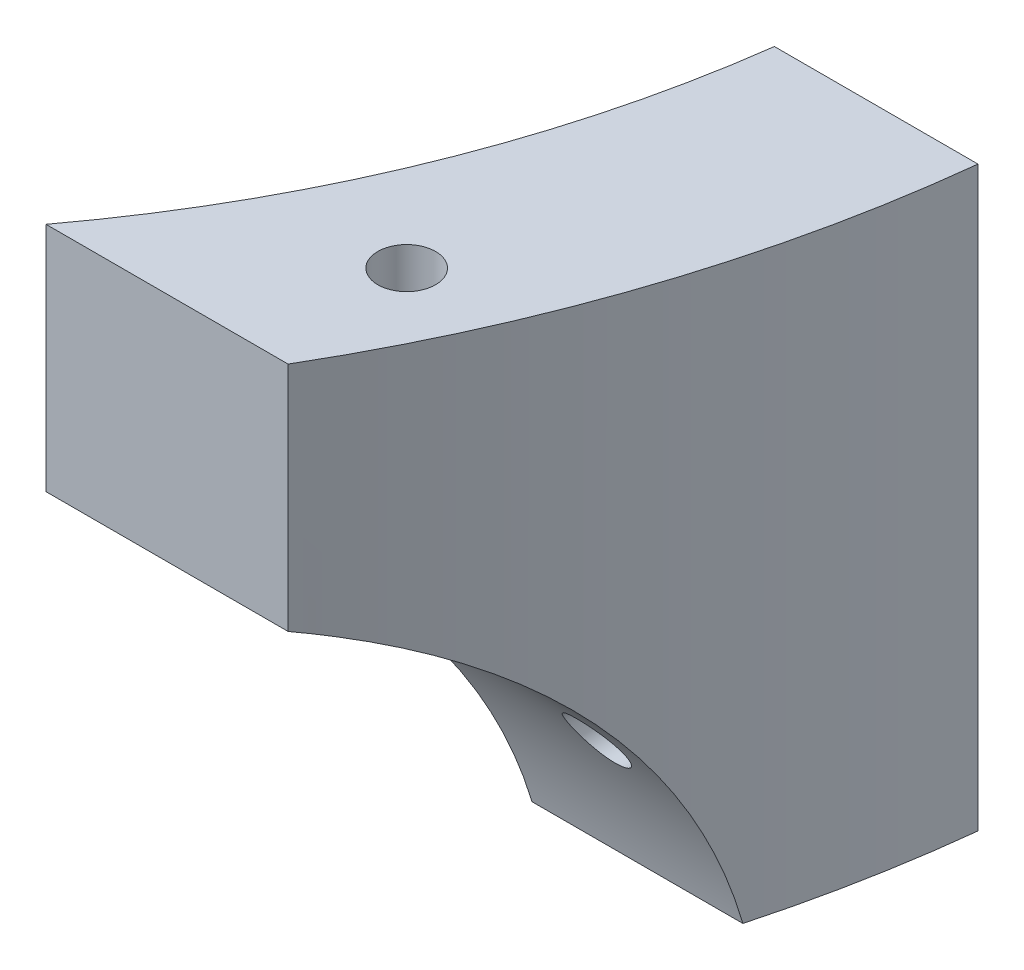
ISO-10303-21;
HEADER;
FILE_DESCRIPTION(('STEP AP214'),'2;1');
FILE_NAME('part.step','',(''),(''),'','','');
FILE_SCHEMA(('AUTOMOTIVE_DESIGN { 1 0 10303 214 1 1 1 1 }'));
ENDSEC;
DATA;
#1=APPLICATION_CONTEXT('core data for automotive mechanical design processes');
#2=APPLICATION_PROTOCOL_DEFINITION('international standard','automotive_design',2000,#1);
#3=PRODUCT_CONTEXT('',#1,'mechanical');
#4=PRODUCT('Part','Part','',(#3));
#5=PRODUCT_RELATED_PRODUCT_CATEGORY('part','',(#4));
#6=PRODUCT_DEFINITION_FORMATION('','',#4);
#7=PRODUCT_DEFINITION_CONTEXT('part definition',#1,'design');
#8=PRODUCT_DEFINITION('design','',#6,#7);
#9=PRODUCT_DEFINITION_SHAPE('','',#8);
#10=(LENGTH_UNIT() NAMED_UNIT(*) SI_UNIT(.MILLI.,.METRE.));
#11=(NAMED_UNIT(*) PLANE_ANGLE_UNIT() SI_UNIT($,.RADIAN.));
#12=(NAMED_UNIT(*) SI_UNIT($,.STERADIAN.) SOLID_ANGLE_UNIT());
#13=UNCERTAINTY_MEASURE_WITH_UNIT(LENGTH_MEASURE(1.E-05),#10,'distance_accuracy_value','');
#14=(GEOMETRIC_REPRESENTATION_CONTEXT(3) GLOBAL_UNCERTAINTY_ASSIGNED_CONTEXT((#13)) GLOBAL_UNIT_ASSIGNED_CONTEXT((#10,
#11,#12)) REPRESENTATION_CONTEXT('',''));
#15=CARTESIAN_POINT('',(0.,0.,0.));
#16=DIRECTION('',(0.,0.,1.));
#17=DIRECTION('',(1.,0.,0.));
#18=AXIS2_PLACEMENT_3D('',#15,#16,#17);
#19=CARTESIAN_POINT('',(0.,-100.,0.));
#20=DIRECTION('',(0.,-1.,0.));
#21=DIRECTION('',(0.,0.,-1.));
#22=AXIS2_PLACEMENT_3D('',#19,#20,#21);
#23=PLANE('',#22);
#24=DIRECTION('',(1.,0.,0.));
#25=VECTOR('',#24,1.);
#26=CARTESIAN_POINT('',(-91.805,-100.,23.690614962727));
#27=LINE('',#26,#25);
#28=CARTESIAN_POINT('',(73.0599944407869,-100.,23.690614962727));
#29=VERTEX_POINT('',#28);
#30=CARTESIAN_POINT('',(87.6601550745138,-100.,23.690614962727));
#31=VERTEX_POINT('',#30);
#32=EDGE_CURVE('E96',#29,#31,#27,.T.);
#33=ORIENTED_EDGE('',*,*,#32,.F.);
#34=CARTESIAN_POINT('',(0.,-100.,0.));
#35=DIRECTION('',(0.,-1.,0.));
#36=DIRECTION('',(0.,0.,-1.));
#37=AXIS2_PLACEMENT_3D('',#34,#35,#36);
#38=CIRCLE('',#37,76.805);
#39=CARTESIAN_POINT('',(76.1512181452142,-100.,9.99999999999961));
#40=VERTEX_POINT('',#39);
#41=EDGE_CURVE('E105',#29,#40,#38,.F.);
#42=ORIENTED_EDGE('',*,*,#41,.T.);
#43=DIRECTION('',(-1.,0.,0.));
#44=VECTOR('',#43,1.);
#45=CARTESIAN_POINT('',(0.,-100.,9.99999999999961));
#46=LINE('',#45,#44);
#47=CARTESIAN_POINT('',(90.252689849112,-100.,9.99999999999954));
#48=VERTEX_POINT('',#47);
#49=EDGE_CURVE('E100',#48,#40,#46,.T.);
#50=ORIENTED_EDGE('',*,*,#49,.F.);
#51=CARTESIAN_POINT('',(0.,-100.,0.));
#52=DIRECTION('',(0.,-1.,0.));
#53=DIRECTION('',(0.,0.,-1.));
#54=AXIS2_PLACEMENT_3D('',#51,#52,#53);
#55=CIRCLE('',#54,90.805);
#56=EDGE_CURVE('E87',#48,#31,#55,.T.);
#57=ORIENTED_EDGE('',*,*,#56,.T.);
#58=EDGE_LOOP('',(#33,#42,#50,#57));
#59=FACE_BOUND('',#58,.T.);
#60=ADVANCED_FACE('F34',(#59),#23,.T.);
#61=CARTESIAN_POINT('',(-91.805,-108.000167786146,56.3599898084857));
#62=DIRECTION('',(1.,0.,0.));
#63=DIRECTION('',(0.,0.,-1.));
#64=AXIS2_PLACEMENT_3D('',#61,#62,#63);
#65=CYLINDRICAL_SURFACE('',#64,33.6346657099366);
#66=CARTESIAN_POINT('',(76.7086084527525,-79.8030744101467,38.0238325620955));
#67=CARTESIAN_POINT('',(76.8074631880523,-79.8030738975218,38.0238333420797));
#68=CARTESIAN_POINT('',(76.9063170143825,-79.8078602212486,38.016466701305));
#69=CARTESIAN_POINT('',(77.100979430438,-79.826771626466,37.9874347832381));
#70=CARTESIAN_POINT('',(77.1967874217015,-79.8408985315017,37.9657667139049));
#71=CARTESIAN_POINT('',(77.3823659916335,-79.8777880488034,37.909417659888));
#72=CARTESIAN_POINT('',(77.4721542012125,-79.9005240178486,37.8747768267452));
#73=CARTESIAN_POINT('',(77.6439846819798,-79.9537186859987,37.7941676455856));
#74=CARTESIAN_POINT('',(77.726025374595,-79.9841789543068,37.7481969959527));
#75=CARTESIAN_POINT('',(77.8852347753342,-80.0536421232424,37.6440458711227));
#76=CARTESIAN_POINT('',(77.9618881490843,-80.0930224280342,37.5853333277198));
#77=CARTESIAN_POINT('',(78.1041276888143,-80.1779945740988,37.4596412940791));
#78=CARTESIAN_POINT('',(78.1697096835087,-80.2235887448855,37.3926587043771));
#79=CARTESIAN_POINT('',(78.2985043515619,-80.3271497210448,37.2418211856355));
#80=CARTESIAN_POINT('',(78.359854226063,-80.385944582878,37.1569472818849));
#81=CARTESIAN_POINT('',(78.4673962810873,-80.5087300873957,36.9815719394238));
#82=CARTESIAN_POINT('',(78.5135788486691,-80.5727239932793,36.8910669748327));
#83=CARTESIAN_POINT('',(78.598069532826,-80.7164303844296,36.6900572386444));
#84=CARTESIAN_POINT('',(78.6334789202214,-80.796903269908,36.5788771910687));
#85=CARTESIAN_POINT('',(78.6844148012419,-80.961384484584,36.3546323857026));
#86=CARTESIAN_POINT('',(78.6999311814584,-81.0453945896718,36.2415666988364));
#87=CARTESIAN_POINT('',(78.7127559067162,-81.2293065387434,35.9973102270788));
#88=CARTESIAN_POINT('',(78.7066554835882,-81.3295524238264,35.8661922772089));
#89=CARTESIAN_POINT('',(78.6691771852617,-81.530283205128,35.6075727790299));
#90=CARTESIAN_POINT('',(78.6377657442649,-81.6307682419527,35.4800762658109));
#91=CARTESIAN_POINT('',(78.546288983805,-81.8372421202246,35.2218367996325));
#92=CARTESIAN_POINT('',(78.4841159978511,-81.9430207721474,35.0916620796919));
#93=CARTESIAN_POINT('',(78.3299706100813,-82.1472912330253,34.8438296540359));
#94=CARTESIAN_POINT('',(78.2380571974696,-82.2457969963926,34.7261477777904));
#95=CARTESIAN_POINT('',(78.0609694914206,-82.3975724572225,34.5469989636401));
#96=CARTESIAN_POINT('',(77.9844781578502,-82.4546966033524,34.4801750261197));
#97=CARTESIAN_POINT('',(77.8185637564106,-82.5607950150454,34.3569077312002));
#98=CARTESIAN_POINT('',(77.729161972172,-82.6097824141519,34.3004476297094));
#99=CARTESIAN_POINT('',(77.5556728899328,-82.6887348952749,34.2099322661352));
#100=CARTESIAN_POINT('',(77.4735825599574,-82.7205395048951,34.1736693137063));
#101=CARTESIAN_POINT('',(77.302523756611,-82.7748905176247,34.1118927299615));
#102=CARTESIAN_POINT('',(77.2135591722291,-82.7974421105524,34.0863730727525));
#103=CARTESIAN_POINT('',(77.0302923510155,-82.8317260916055,34.0476396072101));
#104=CARTESIAN_POINT('',(76.935959315251,-82.8433875660741,34.0345064511625));
#105=CARTESIAN_POINT('',(76.7456776423994,-82.8545733596933,34.0219079858106));
#106=CARTESIAN_POINT('',(76.6497297694618,-82.8541032666764,34.022436383958));
#107=CARTESIAN_POINT('',(76.4700007841442,-82.8418016095751,34.0362937257992));
#108=CARTESIAN_POINT('',(76.3860207942212,-82.8311971768558,34.0482401206851));
#109=CARTESIAN_POINT('',(76.2217815161715,-82.8011556792901,34.0821749458543));
#110=CARTESIAN_POINT('',(76.1415227040881,-82.7817174877743,34.1041646570772));
#111=CARTESIAN_POINT('',(75.9833960606358,-82.7343028337479,34.158005024986));
#112=CARTESIAN_POINT('',(75.9057371254535,-82.7060282071829,34.1902007073067));
#113=CARTESIAN_POINT('',(75.7572686340529,-82.642717061117,34.2626426869511));
#114=CARTESIAN_POINT('',(75.6864631060374,-82.6076766006856,34.3028936767924));
#115=CARTESIAN_POINT('',(75.520202393519,-82.5142113696833,34.4108677396943));
#116=CARTESIAN_POINT('',(75.429086468424,-82.4526019232963,34.4825400804407));
#117=CARTESIAN_POINT('',(75.2632942760188,-82.3213293842057,34.6367691745697));
#118=CARTESIAN_POINT('',(75.1886548698492,-82.2516487548236,34.7193496854508));
#119=CARTESIAN_POINT('',(75.0382582503987,-82.0881041714256,34.9152729362535));
#120=CARTESIAN_POINT('',(74.9673159269042,-81.9926822265783,35.0310119134057));
#121=CARTESIAN_POINT('',(74.8508328978413,-81.7975637788303,35.2711707646397));
#122=CARTESIAN_POINT('',(74.8053008229314,-81.6978658359416,35.3955935720835));
#123=CARTESIAN_POINT('',(74.7391746646042,-81.4961912724539,35.6511343536208));
#124=CARTESIAN_POINT('',(74.7188227453968,-81.3942019853096,35.782304894407));
#125=CARTESIAN_POINT('',(74.7043503275137,-81.1914513139683,36.047154215224));
#126=CARTESIAN_POINT('',(74.7102436678378,-81.0906906056792,36.1808342815146));
#127=CARTESIAN_POINT('',(74.750524723525,-80.8867957470755,36.4555474962871));
#128=CARTESIAN_POINT('',(74.7866776765969,-80.7839095707219,36.5965155340601));
#129=CARTESIAN_POINT('',(74.8913395557247,-80.5860897067,36.8718487470639));
#130=CARTESIAN_POINT('',(74.9597870713606,-80.4911413264399,37.0062259221539));
#131=CARTESIAN_POINT('',(75.104252993412,-80.3402590193032,37.2227985729211));
#132=CARTESIAN_POINT('',(75.1717700687823,-80.2811920145813,37.3085136071337));
#133=CARTESIAN_POINT('',(75.3229256857671,-80.1707261400003,37.4702447312109));
#134=CARTESIAN_POINT('',(75.4065571324855,-80.1193239130669,37.5462650651054));
#135=CARTESIAN_POINT('',(75.5897719156697,-80.0257857442373,37.6856272623836));
#136=CARTESIAN_POINT('',(75.6894845103461,-79.9837320769019,37.7488561455346));
#137=CARTESIAN_POINT('',(75.9019735759856,-79.9116471300976,37.8578263825141));
#138=CARTESIAN_POINT('',(76.0147320094509,-79.8815995009962,37.9035915143534));
#139=CARTESIAN_POINT('',(76.2242795122289,-79.840287785588,37.9667030348256));
#140=CARTESIAN_POINT('',(76.3193683200653,-79.8263886578759,37.9880223866509));
#141=CARTESIAN_POINT('',(76.5125088976747,-79.8077845810088,38.0165831550542));
#142=CARTESIAN_POINT('',(76.6105591223229,-79.8030749185952,38.0238317884661));
#143=CARTESIAN_POINT('',(76.7086084527525,-79.8030744101467,38.0238325620955));
#144=B_SPLINE_CURVE_WITH_KNOTS('',3,(#66,#67,#68,#69,#70,#71,#72,#73,#74,#75,#76,#77,#78,#79,
#80,#81,#82,#83,#84,#85,#86,#87,#88,#89,#90,#91,#92,#93,#94,#95,#96,#97,#98,#99,#100,#101,#102,
#103,#104,#105,#106,#107,#108,#109,#110,#111,#112,#113,#114,#115,#116,#117,#118,#119,#120,#121,
#122,#123,#124,#125,#126,#127,#128,#129,#130,#131,#132,#133,#134,#135,#136,#137,#138,#139,#140,
#141,#142,#143),.UNSPECIFIED.,.T.,.F.,(4,2,2,2,2,2,2,2,2,2,2,2,2,2,2,2,2,2,2,2,2,2,2,2,2,2,2,2,
2,2,2,2,2,2,2,2,2,2,4),(0.,0.296183059627792,0.592423959629206,0.887755452545223,
1.18314699063767,1.49476809760526,1.80650635109705,2.16545321568322,2.52462714141039,
2.9482324067888,3.37205294362371,3.86547684730995,4.35955617616897,4.89350488274258,
5.42640094496851,5.77481014804785,6.12265139988388,6.40714902159363,6.69148685584818,
6.9776635720897,7.26370847692072,7.51899505208358,7.77431419597596,8.03939982135584,
8.30464032088804,8.69631909644513,9.08886544661426,9.58409564253129,10.0794939424851,
10.5796204888307,11.0800107807286,11.6118081549492,12.1425983291995,12.5133914093928,
12.8840216069173,13.2577947525027,13.6310571506686,13.9249778920575,14.2187478424099),.UNSPECIFIED.);
#145=CARTESIAN_POINT('',(76.7086084527525,-79.8030744101467,38.0238325620955));
#146=VERTEX_POINT('',#145);
#147=EDGE_CURVE('E184',#146,#146,#144,.T.);
#148=ORIENTED_EDGE('',*,*,#147,.T.);
#149=EDGE_LOOP('',(#148));
#150=FACE_BOUND('',#149,.T.);
#151=CARTESIAN_POINT('',(80.252689849112,-89.3600280202331,28.3629198381048));
#152=CARTESIAN_POINT('',(80.2526912522656,-89.218517691349,28.4571378059981));
#153=CARTESIAN_POINT('',(80.2677006344146,-89.0776655217365,28.5524789468897));
#154=CARTESIAN_POINT('',(80.3270662421826,-88.8014937174829,28.7424263371741));
#155=CARTESIAN_POINT('',(80.3714626547208,-88.6661819287826,28.8370314004827));
#156=CARTESIAN_POINT('',(80.4867218656363,-88.41131335724,29.0178819014394));
#157=CARTESIAN_POINT('',(80.5563341533893,-88.2913253129252,29.1043120072572));
#158=CARTESIAN_POINT('',(80.7220565925141,-88.0651439100761,29.2693079249137));
#159=CARTESIAN_POINT('',(80.8181002106033,-87.9589168867389,29.3478928167514));
#160=CARTESIAN_POINT('',(81.0014515022406,-87.7966072750411,29.4692159194503));
#161=CARTESIAN_POINT('',(81.0818745510073,-87.7353044033138,29.5154199162609));
#162=CARTESIAN_POINT('',(81.2541487292052,-87.6241128945463,29.5997211921549));
#163=CARTESIAN_POINT('',(81.3459932801024,-87.5742177334975,29.6378231039009));
#164=CARTESIAN_POINT('',(81.5404692042477,-87.4880920325661,29.7038744734995));
#165=CARTESIAN_POINT('',(81.6431908424873,-87.4519895100127,29.7317287330534));
#166=CARTESIAN_POINT('',(81.8556715528129,-87.3967717825963,29.7744285828653));
#167=CARTESIAN_POINT('',(81.965421883584,-87.3776359005536,29.7892900071326));
#168=CARTESIAN_POINT('',(82.1711361356633,-87.3594271559946,29.8034338991971));
#169=CARTESIAN_POINT('',(82.2667474729748,-87.3578126240353,29.8046899241227));
#170=CARTESIAN_POINT('',(82.456760165967,-87.3681953187991,29.796622272137));
#171=CARTESIAN_POINT('',(82.5511617979064,-87.3801893796346,29.7873010559032));
#172=CARTESIAN_POINT('',(82.7301662194213,-87.4158463453047,29.7596719878835));
#173=CARTESIAN_POINT('',(82.8150151367359,-87.4387503003944,29.7419489481131));
#174=CARTESIAN_POINT('',(82.9792413434667,-87.4946453852071,29.6988659041624));
#175=CARTESIAN_POINT('',(83.058617507645,-87.5276385818169,29.6735043351655));
#176=CARTESIAN_POINT('',(83.2176637827256,-87.6057798760004,29.6137320234502));
#177=CARTESIAN_POINT('',(83.296684288257,-87.651769006828,29.5787019500785));
#178=CARTESIAN_POINT('',(83.4457875930946,-87.7523529907083,29.5025752863149));
#179=CARTESIAN_POINT('',(83.5158654884074,-87.8069525292003,29.4614753937482));
#180=CARTESIAN_POINT('',(83.6586010806802,-87.9338032701895,29.3666740906567));
#181=CARTESIAN_POINT('',(83.7293916818367,-88.0074570101916,29.3120421920051));
#182=CARTESIAN_POINT('',(83.8576306079131,-88.16240708522,29.1981920682725));
#183=CARTESIAN_POINT('',(83.9150700873512,-88.2437084371854,29.1389708370763));
#184=CARTESIAN_POINT('',(84.026771811007,-88.4291260028297,29.0052721766148));
#185=CARTESIAN_POINT('',(84.0780754666407,-88.5345435912346,28.9301206375527));
#186=CARTESIAN_POINT('',(84.1613282135628,-88.7512652879117,28.777602411851));
#187=CARTESIAN_POINT('',(84.1932648316207,-88.8625731397144,28.7002343311754));
#188=CARTESIAN_POINT('',(84.2406684919595,-89.1046709260939,28.5341862978289));
#189=CARTESIAN_POINT('',(84.2531962061381,-89.2360032015602,28.4454422111528));
#190=CARTESIAN_POINT('',(84.25215189995,-89.4999506909898,28.2698161072916));
#191=CARTESIAN_POINT('',(84.238563003953,-89.6325666793494,28.1829353307928));
#192=CARTESIAN_POINT('',(84.1839306551936,-89.8975661017236,28.0119413170678));
#193=CARTESIAN_POINT('',(84.1423865096967,-90.0299003336932,27.9279084455895));
#194=CARTESIAN_POINT('',(84.0305784297958,-90.28665772827,27.7672434862293));
#195=CARTESIAN_POINT('',(83.9603623403731,-90.411093673001,27.6905993308736));
#196=CARTESIAN_POINT('',(83.813234552249,-90.6155048599556,27.5663324898372));
#197=CARTESIAN_POINT('',(83.7427298267729,-90.6986654119396,27.5163253912006));
#198=CARTESIAN_POINT('',(83.5866323478485,-90.8542554321589,27.4235662348201));
#199=CARTESIAN_POINT('',(83.501047187586,-90.9266902673042,27.3808105470638));
#200=CARTESIAN_POINT('',(83.315644035452,-91.0580004390346,27.3038448733183));
#201=CARTESIAN_POINT('',(83.2157398048065,-91.1167875101537,27.2696904006841));
#202=CARTESIAN_POINT('',(83.0047488983191,-91.2169095115892,27.2118105401086));
#203=CARTESIAN_POINT('',(82.8936694432905,-91.2582556227283,27.1880784703068));
#204=CARTESIAN_POINT('',(82.6774286880333,-91.3172416994415,27.1543099492793));
#205=CARTESIAN_POINT('',(82.5730561437351,-91.3370612993382,27.1430122251442));
#206=CARTESIAN_POINT('',(82.3619173808097,-91.3598589785468,27.1300215393748));
#207=CARTESIAN_POINT('',(82.2551524645316,-91.3628460077372,27.1283234736002));
#208=CARTESIAN_POINT('',(82.0506047601079,-91.3522331043274,27.1343669958675));
#209=CARTESIAN_POINT('',(81.9527362810752,-91.3398306730013,27.1414270750049));
#210=CARTESIAN_POINT('',(81.7607667003979,-91.3010583485693,27.1635692282412));
#211=CARTESIAN_POINT('',(81.6666653941342,-91.2746892151933,27.1786508660011));
#212=CARTESIAN_POINT('',(81.4838486898089,-91.2089209870821,27.2164449530412));
#213=CARTESIAN_POINT('',(81.3951863858957,-91.1694121161543,27.2392217177284));
#214=CARTESIAN_POINT('',(81.2260403736403,-91.079095101194,27.291609148098));
#215=CARTESIAN_POINT('',(81.1455586712683,-91.0282841954745,27.3212214841402));
#216=CARTESIAN_POINT('',(80.9881970233591,-90.9128669194592,27.3889751045422));
#217=CARTESIAN_POINT('',(80.9120923467246,-90.8474919427431,27.4276026139997));
#218=CARTESIAN_POINT('',(80.7719817138682,-90.7080948260554,27.5106997207636));
#219=CARTESIAN_POINT('',(80.7079815132791,-90.6340685993782,27.5551720803249));
#220=CARTESIAN_POINT('',(80.5852602747488,-90.4697488499692,27.6548423288401));
#221=CARTESIAN_POINT('',(80.5282345890566,-90.3785824908551,27.7106852553091));
#222=CARTESIAN_POINT('',(80.4303111829344,-90.1907893983237,27.8270439497223));
#223=CARTESIAN_POINT('',(80.3894185390953,-90.0941609570686,27.8875611813803));
#224=CARTESIAN_POINT('',(80.3216156305586,-89.8919830561987,28.0156867398863));
#225=CARTESIAN_POINT('',(80.2956692691389,-89.7862431739853,28.0835027879254));
#226=CARTESIAN_POINT('',(80.2612004570071,-89.5735542340117,28.2216391286503));
#227=CARTESIAN_POINT('',(80.2526887923473,-89.466604468861,28.2919609441908));
#228=CARTESIAN_POINT('',(80.252689849112,-89.3600280202331,28.3629198381048));
#229=B_SPLINE_CURVE_WITH_KNOTS('',3,(#151,#152,#153,#154,#155,#156,#157,#158,#159,#160,#161,
#162,#163,#164,#165,#166,#167,#168,#169,#170,#171,#172,#173,#174,#175,#176,#177,#178,#179,#180,
#181,#182,#183,#184,#185,#186,#187,#188,#189,#190,#191,#192,#193,#194,#195,#196,#197,#198,#199,
#200,#201,#202,#203,#204,#205,#206,#207,#208,#209,#210,#211,#212,#213,#214,#215,#216,#217,#218,
#219,#220,#221,#222,#223,#224,#225,#226,#227,#228),.UNSPECIFIED.,.T.,.F.,(4,2,2,2,2,2,2,2,2,2,2,
2,2,2,2,2,2,2,2,2,2,2,2,2,2,2,2,2,2,2,2,2,2,2,2,2,2,2,4),(0.,0.509524266156808,1.01974675293997,
1.50751880872896,1.99407409537153,2.32636717727305,2.65846974452322,2.99358390296581,
3.3282890954762,3.61365546830261,3.89895546742961,4.16679742046731,4.43469428053815,
4.72732749851309,5.02012050876882,5.36639758466885,5.71290342876809,6.12904839778024,
6.54546109873484,7.02029655659882,7.49543893951016,7.97932622586562,8.46240932614203,
8.82079350469927,9.17899774535529,9.5394578234118,9.89968646995233,10.2184829882252,
10.5371099863706,10.8324264921485,11.1277269355968,11.4255591862159,11.7234642931632,
12.0446921872617,12.3660724420981,12.7281580311149,13.090357467051,13.4738610821482,
13.8576018818835),.UNSPECIFIED.);
#230=CARTESIAN_POINT('',(80.252689849112,-89.3600280202331,28.3629198381048));
#231=VERTEX_POINT('',#230);
#232=EDGE_CURVE('E137',#231,#231,#229,.T.);
#233=ORIENTED_EDGE('',*,*,#232,.T.);
#234=EDGE_LOOP('',(#233));
#235=FACE_BOUND('',#234,.T.);
#236=ORIENTED_EDGE('',*,*,#32,.T.);
#237=CARTESIAN_POINT('',(87.6601550745138,-100.,23.690614962727));
#238=CARTESIAN_POINT('',(87.6309146409676,-99.5582270532689,23.7987903529996));
#239=CARTESIAN_POINT('',(87.5990558306299,-99.1188185983287,23.9158992066065));
#240=CARTESIAN_POINT('',(87.5299242538016,-98.2454988321091,24.1676991882331));
#241=CARTESIAN_POINT('',(87.4926514770593,-97.8115875312407,24.3023903495465));
#242=CARTESIAN_POINT('',(87.4125156290401,-96.9500400269717,24.589067182315));
#243=CARTESIAN_POINT('',(87.369652663084,-96.5224037055175,24.7410525279358));
#244=CARTESIAN_POINT('',(87.2781424524507,-95.6741962651977,25.0619570325673));
#245=CARTESIAN_POINT('',(87.2294952220577,-95.2536251288876,25.2308761497603));
#246=CARTESIAN_POINT('',(87.0746877030573,-94.0046710251831,25.7620459443834));
#247=CARTESIAN_POINT('',(86.9595445774442,-93.1877718538715,26.1491341707727));
#248=CARTESIAN_POINT('',(86.7035506629067,-91.5910077285846,26.9858020944198));
#249=CARTESIAN_POINT('',(86.5627006295914,-90.8111416869346,27.4353799548125));
#250=CARTESIAN_POINT('',(86.2532981145141,-89.2931803634732,28.393131381572));
#251=CARTESIAN_POINT('',(86.0847252847527,-88.5551163024875,28.9013479052129));
#252=CARTESIAN_POINT('',(85.7181545346951,-87.1264400456231,29.9710784567554));
#253=CARTESIAN_POINT('',(85.5201560977432,-86.4358286832319,30.53259342041));
#254=CARTESIAN_POINT('',(85.0931646526832,-85.1066151898962,31.703142958038));
#255=CARTESIAN_POINT('',(84.8641764957353,-84.4680049436589,32.3121700881044));
#256=CARTESIAN_POINT('',(84.3739007695728,-83.2464293462711,33.57155554728));
#257=CARTESIAN_POINT('',(84.1126142639453,-82.6634621639101,34.2219125150521));
#258=CARTESIAN_POINT('',(83.5564941386276,-81.5553169793308,35.5581862817601));
#259=CARTESIAN_POINT('',(83.2616168486545,-81.0302159917782,36.2441487251418));
#260=CARTESIAN_POINT('',(82.6381574982986,-80.0406098024235,37.6439895083848));
#261=CARTESIAN_POINT('',(82.3095717839275,-79.5761111823336,38.3578708694515));
#262=CARTESIAN_POINT('',(81.6190709229777,-78.7090707708359,39.806009538802));
#263=CARTESIAN_POINT('',(81.2571773877745,-78.3064892519784,40.5402534219982));
#264=CARTESIAN_POINT('',(80.5005849132904,-77.563085659544,42.0225616688551));
#265=CARTESIAN_POINT('',(80.105899217846,-77.2222388282199,42.7706203590796));
#266=CARTESIAN_POINT('',(79.480773296113,-76.7495372665461,43.9153218615551));
#267=CARTESIAN_POINT('',(79.2618443276316,-76.5955753510249,44.3092930162411));
#268=CARTESIAN_POINT('',(78.8159069045267,-76.3042908103359,45.0977350388794));
#269=CARTESIAN_POINT('',(78.5889144155218,-76.1669374431318,45.4922035743847));
#270=CARTESIAN_POINT('',(78.3577667284712,-76.0376066251599,45.8869090081963));
#271=B_SPLINE_CURVE_WITH_KNOTS('',3,(#237,#238,#239,#240,#241,#242,#243,#244,#245,#246,#247,
#248,#249,#250,#251,#252,#253,#254,#255,#256,#257,#258,#259,#260,#261,#262,#263,#264,#265,#266,
#267,#268,#269,#270),.UNSPECIFIED.,.F.,.F.,(4,2,2,2,2,2,2,2,2,2,2,2,2,2,2,2,4),(0.,
1.36718200591948,2.73436660076041,4.10152544117546,5.46868090549962,8.19895604622811,
10.9291509482554,13.6613587784873,16.3936145865799,19.1254431784267,21.8571818349041,
24.5925133637657,27.3281417161062,30.0620074367266,32.7947743431797,34.2233178368993,
35.6491752833978),.UNSPECIFIED.);
#272=CARTESIAN_POINT('',(78.3577667284712,-76.0376066251599,45.8869090081963));
#273=VERTEX_POINT('',#272);
#274=EDGE_CURVE('E117',#31,#273,#271,.T.);
#275=ORIENTED_EDGE('',*,*,#274,.T.);
#276=DIRECTION('',(1.,0.,0.));
#277=VECTOR('',#276,1.);
#278=CARTESIAN_POINT('',(-91.805,-76.0376066251599,45.8869090081963));
#279=LINE('',#278,#277);
#280=CARTESIAN_POINT('',(61.5905805028173,-76.0376066251599,45.8869090081963));
#281=VERTEX_POINT('',#280);
#282=EDGE_CURVE('E167',#281,#273,#279,.T.);
#283=ORIENTED_EDGE('',*,*,#282,.F.);
#284=CARTESIAN_POINT('',(73.0599944407869,-100.,23.690614962727));
#285=CARTESIAN_POINT('',(73.0254903331157,-99.565522425293,23.7970033950321));
#286=CARTESIAN_POINT('',(72.9879451110618,-99.1334016530759,23.9120169328063));
#287=CARTESIAN_POINT('',(72.9065715540669,-98.2746285789678,24.158994155574));
#288=CARTESIAN_POINT('',(72.8627431956204,-97.8479762975414,24.290957903979));
#289=CARTESIAN_POINT('',(72.7686030853388,-97.0009014679731,24.5715336452272));
#290=CARTESIAN_POINT('',(72.7182913815018,-96.5804788737371,24.7201455148189));
#291=CARTESIAN_POINT('',(72.6109668269498,-95.7466463394466,25.0336363372437));
#292=CARTESIAN_POINT('',(72.5539539964743,-95.3332363782161,25.1985152409451));
#293=CARTESIAN_POINT('',(72.3726494804507,-94.1055987152668,25.7165645262563));
#294=CARTESIAN_POINT('',(72.2379602204125,-93.3027635778211,26.0935456426208));
#295=CARTESIAN_POINT('',(71.9389123960309,-91.7337821017035,26.907034570689));
#296=CARTESIAN_POINT('',(71.7745548646913,-90.967634486803,27.3435403097069));
#297=CARTESIAN_POINT('',(71.4139556980102,-89.4765479541124,28.2719480259201));
#298=CARTESIAN_POINT('',(71.2176860161786,-88.7516460492144,28.7638986139185));
#299=CARTESIAN_POINT('',(70.7914528461497,-87.3486859186278,29.7974929302104));
#300=CARTESIAN_POINT('',(70.5614887969271,-86.6706284731955,30.3391374858727));
#301=CARTESIAN_POINT('',(70.066336403702,-85.3658740223663,31.4657723478197));
#302=CARTESIAN_POINT('',(69.801163841521,-84.7391542077822,32.0507431819411));
#303=CARTESIAN_POINT('',(69.2342929315144,-83.5401645225451,33.2575553717361));
#304=CARTESIAN_POINT('',(68.9325955901839,-82.9678931522593,33.8793957111744));
#305=CARTESIAN_POINT('',(68.2917432191704,-81.8798854247265,35.1532989950403));
#306=CARTESIAN_POINT('',(67.9525637792321,-81.3641863510135,35.8053814723814));
#307=CARTESIAN_POINT('',(67.2367328870513,-80.3911381566973,37.1321683005325));
#308=CARTESIAN_POINT('',(66.8600783026406,-79.9337939206886,37.806874539104));
#309=CARTESIAN_POINT('',(66.0697472035868,-79.0778453915696,39.1716522776844));
#310=CARTESIAN_POINT('',(65.6560691341393,-78.6792435672139,39.8617244220707));
#311=CARTESIAN_POINT('',(64.79277787333,-77.9402163629166,41.2501145074061));
#312=CARTESIAN_POINT('',(64.3431755122781,-77.5997735458329,41.948429909508));
#313=CARTESIAN_POINT('',(63.5149954930007,-77.0459573100791,43.1888496352309));
#314=CARTESIAN_POINT('',(63.1433420577473,-76.8212570833388,43.7305761336415));
#315=CARTESIAN_POINT('',(62.3811244922268,-76.4050722225581,44.811167654372));
#316=CARTESIAN_POINT('',(61.9906123888517,-76.2135022140975,45.3500364550486));
#317=CARTESIAN_POINT('',(61.5905805028132,-76.0376066251599,45.8869090081963));
#318=B_SPLINE_CURVE_WITH_KNOTS('',3,(#284,#285,#286,#287,#288,#289,#290,#291,#292,#293,#294,
#295,#296,#297,#298,#299,#300,#301,#302,#303,#304,#305,#306,#307,#308,#309,#310,#311,#312,#313,
#314,#315,#316,#317),.UNSPECIFIED.,.F.,.F.,(4,2,2,2,2,2,2,2,2,2,2,2,2,2,2,2,4),(0.,
1.34582075493443,2.69164654480015,4.03746237173253,5.38327413397888,8.07109732988472,
10.7588269579409,13.4489316355438,16.1390811095913,18.8280287995816,21.5169024084456,
24.2075375854001,26.898397834554,29.5893711396751,32.2795362200218,34.3614815849997,
36.4379792711811),.UNSPECIFIED.);
#319=EDGE_CURVE('E57',#29,#281,#318,.T.);
#320=ORIENTED_EDGE('',*,*,#319,.F.);
#321=EDGE_LOOP('',(#236,#275,#283,#320));
#322=FACE_BOUND('',#321,.T.);
#323=ADVANCED_FACE('F123',(#150,#235,#322),#65,.F.);
#324=CARTESIAN_POINT('',(0.,-100.,9.99999999999961));
#325=DIRECTION('',(0.,0.,-1.));
#326=DIRECTION('',(-1.,0.,0.));
#327=AXIS2_PLACEMENT_3D('',#324,#325,#326);
#328=PLANE('',#327);
#329=CARTESIAN_POINT('',(82.252689849112,-89.3600280202331,9.99999999999961));
#330=DIRECTION('',(0.,0.,-1.));
#331=DIRECTION('',(-1.,0.,0.));
#332=AXIS2_PLACEMENT_3D('',#329,#330,#331);
#333=CIRCLE('',#332,2.);
#334=CARTESIAN_POINT('',(80.252689849112,-89.3600280202331,9.99999999999961));
#335=VERTEX_POINT('',#334);
#336=EDGE_CURVE('E145',#335,#335,#333,.T.);
#337=ORIENTED_EDGE('',*,*,#336,.F.);
#338=EDGE_LOOP('',(#337));
#339=FACE_BOUND('',#338,.T.);
#340=DIRECTION('',(-1.,0.,0.));
#341=VECTOR('',#340,1.);
#342=CARTESIAN_POINT('',(0.,-60.,9.99999999999961));
#343=LINE('',#342,#341);
#344=CARTESIAN_POINT('',(90.252689849112,-60.,9.99999999999961));
#345=VERTEX_POINT('',#344);
#346=CARTESIAN_POINT('',(76.1512181452142,-60.,9.99999999999961));
#347=VERTEX_POINT('',#346);
#348=EDGE_CURVE('E80',#345,#347,#343,.T.);
#349=ORIENTED_EDGE('',*,*,#348,.F.);
#350=DIRECTION('',(0.,1.,0.));
#351=VECTOR('',#350,1.);
#352=CARTESIAN_POINT('',(90.252689849112,-100.,9.99999999999954));
#353=LINE('',#352,#351);
#354=EDGE_CURVE('E101',#48,#345,#353,.T.);
#355=ORIENTED_EDGE('',*,*,#354,.F.);
#356=ORIENTED_EDGE('',*,*,#49,.T.);
#357=DIRECTION('',(0.,1.,0.));
#358=VECTOR('',#357,1.);
#359=CARTESIAN_POINT('',(76.1512181452142,-100.,9.99999999999961));
#360=LINE('',#359,#358);
#361=EDGE_CURVE('E43',#40,#347,#360,.T.);
#362=ORIENTED_EDGE('',*,*,#361,.T.);
#363=EDGE_LOOP('',(#349,#355,#356,#362));
#364=FACE_BOUND('',#363,.T.);
#365=ADVANCED_FACE('F98',(#339,#364),#328,.T.);
#366=CARTESIAN_POINT('',(-91.805,-59.9171673050235,45.8869090081963));
#367=DIRECTION('',(0.,0.,1.));
#368=DIRECTION('',(1.,0.,0.));
#369=AXIS2_PLACEMENT_3D('',#366,#367,#368);
#370=PLANE('',#369);
#371=DIRECTION('',(1.,0.,0.));
#372=VECTOR('',#371,1.);
#373=CARTESIAN_POINT('',(-91.805,-60.,45.8869090081963));
#374=LINE('',#373,#372);
#375=CARTESIAN_POINT('',(61.5905805028132,-60.,45.8869090081963));
#376=VERTEX_POINT('',#375);
#377=CARTESIAN_POINT('',(78.3577667284712,-60.,45.8869090081963));
#378=VERTEX_POINT('',#377);
#379=EDGE_CURVE('E11',#376,#378,#374,.T.);
#380=ORIENTED_EDGE('',*,*,#379,.F.);
#381=DIRECTION('',(0.,1.,0.));
#382=VECTOR('',#381,1.);
#383=CARTESIAN_POINT('',(61.5905805028132,-60.,45.8869090081963));
#384=LINE('',#383,#382);
#385=EDGE_CURVE('E95',#376,#281,#384,.F.);
#386=ORIENTED_EDGE('',*,*,#385,.T.);
#387=ORIENTED_EDGE('',*,*,#282,.T.);
#388=DIRECTION('',(0.,1.,0.));
#389=VECTOR('',#388,1.);
#390=CARTESIAN_POINT('',(78.3577667284712,-60.,45.8869090081963));
#391=LINE('',#390,#389);
#392=EDGE_CURVE('E88',#378,#273,#391,.F.);
#393=ORIENTED_EDGE('',*,*,#392,.F.);
#394=EDGE_LOOP('',(#380,#386,#387,#393));
#395=FACE_BOUND('',#394,.T.);
#396=ADVANCED_FACE('F129',(#395),#370,.T.);
#397=CARTESIAN_POINT('',(0.,-60.,0.));
#398=DIRECTION('',(0.,1.,0.));
#399=DIRECTION('',(0.,0.,1.));
#400=AXIS2_PLACEMENT_3D('',#397,#398,#399);
#401=CYLINDRICAL_SURFACE('',#400,90.805);
#402=CARTESIAN_POINT('',(0.,-60.,0.));
#403=DIRECTION('',(0.,-1.,0.));
#404=DIRECTION('',(0.,0.,-1.));
#405=AXIS2_PLACEMENT_3D('',#402,#403,#404);
#406=CIRCLE('',#405,90.805);
#407=EDGE_CURVE('E83',#378,#345,#406,.F.);
#408=ORIENTED_EDGE('',*,*,#407,.F.);
#409=ORIENTED_EDGE('',*,*,#392,.T.);
#410=ORIENTED_EDGE('',*,*,#274,.F.);
#411=ORIENTED_EDGE('',*,*,#56,.F.);
#412=ORIENTED_EDGE('',*,*,#354,.T.);
#413=EDGE_LOOP('',(#408,#409,#410,#411,#412));
#414=FACE_BOUND('',#413,.T.);
#415=ADVANCED_FACE('F158',(#414),#401,.T.);
#416=CARTESIAN_POINT('',(0.,-60.,0.));
#417=DIRECTION('',(0.,1.,0.));
#418=DIRECTION('',(0.,0.,1.));
#419=AXIS2_PLACEMENT_3D('',#416,#417,#418);
#420=CYLINDRICAL_SURFACE('',#419,76.805);
#421=ORIENTED_EDGE('',*,*,#385,.F.);
#422=CARTESIAN_POINT('',(0.,-60.,0.));
#423=DIRECTION('',(0.,-1.,0.));
#424=DIRECTION('',(0.,0.,-1.));
#425=AXIS2_PLACEMENT_3D('',#422,#423,#424);
#426=CIRCLE('',#425,76.805);
#427=EDGE_CURVE('E49',#376,#347,#426,.F.);
#428=ORIENTED_EDGE('',*,*,#427,.T.);
#429=ORIENTED_EDGE('',*,*,#361,.F.);
#430=ORIENTED_EDGE('',*,*,#41,.F.);
#431=ORIENTED_EDGE('',*,*,#319,.T.);
#432=EDGE_LOOP('',(#421,#428,#429,#430,#431));
#433=FACE_BOUND('',#432,.T.);
#434=ADVANCED_FACE('F36',(#433),#420,.F.);
#435=CARTESIAN_POINT('',(-91.805,-60.,9.99999999999961));
#436=DIRECTION('',(0.,-1.,0.));
#437=DIRECTION('',(0.,0.,-1.));
#438=AXIS2_PLACEMENT_3D('',#435,#436,#437);
#439=PLANE('',#438);
#440=CARTESIAN_POINT('',(76.7086084527525,-60.,36.0238325620955));
#441=DIRECTION('',(0.,1.,0.));
#442=DIRECTION('',(0.,0.,1.));
#443=AXIS2_PLACEMENT_3D('',#440,#441,#442);
#444=CIRCLE('',#443,2.);
#445=CARTESIAN_POINT('',(76.7086084527525,-60.,38.0238325620955));
#446=VERTEX_POINT('',#445);
#447=EDGE_CURVE('E186',#446,#446,#444,.T.);
#448=ORIENTED_EDGE('',*,*,#447,.F.);
#449=EDGE_LOOP('',(#448));
#450=FACE_BOUND('',#449,.T.);
#451=ORIENTED_EDGE('',*,*,#379,.T.);
#452=ORIENTED_EDGE('',*,*,#407,.T.);
#453=ORIENTED_EDGE('',*,*,#348,.T.);
#454=ORIENTED_EDGE('',*,*,#427,.F.);
#455=EDGE_LOOP('',(#451,#452,#453,#454));
#456=FACE_BOUND('',#455,.T.);
#457=ADVANCED_FACE('F81',(#450,#456),#439,.F.);
#458=CARTESIAN_POINT('',(82.252689849112,-89.3600280202331,64.9999999999996));
#459=DIRECTION('',(0.,0.,-1.));
#460=DIRECTION('',(-1.,0.,0.));
#461=AXIS2_PLACEMENT_3D('',#458,#459,#460);
#462=CYLINDRICAL_SURFACE('',#461,2.);
#463=ORIENTED_EDGE('',*,*,#336,.T.);
#464=EDGE_LOOP('',(#463));
#465=FACE_BOUND('',#464,.T.);
#466=ORIENTED_EDGE('',*,*,#232,.F.);
#467=EDGE_LOOP('',(#466));
#468=FACE_BOUND('',#467,.T.);
#469=ADVANCED_FACE('F146',(#465,#468),#462,.F.);
#470=CARTESIAN_POINT('',(76.7086084527525,-115.,36.0238325620955));
#471=DIRECTION('',(0.,1.,0.));
#472=DIRECTION('',(0.,0.,1.));
#473=AXIS2_PLACEMENT_3D('',#470,#471,#472);
#474=CYLINDRICAL_SURFACE('',#473,2.);
#475=ORIENTED_EDGE('',*,*,#447,.T.);
#476=EDGE_LOOP('',(#475));
#477=FACE_BOUND('',#476,.T.);
#478=ORIENTED_EDGE('',*,*,#147,.F.);
#479=EDGE_LOOP('',(#478));
#480=FACE_BOUND('',#479,.T.);
#481=ADVANCED_FACE('F150',(#477,#480),#474,.F.);
#482=CLOSED_SHELL('',(#60,#323,#365,#396,#415,#434,#457,#469,#481));
#483=MANIFOLD_SOLID_BREP('B2',#482);
#484=ADVANCED_BREP_SHAPE_REPRESENTATION('',(#18,#483),#14);
#485=SHAPE_DEFINITION_REPRESENTATION(#9,#484);
ENDSEC;
END-ISO-10303-21;
